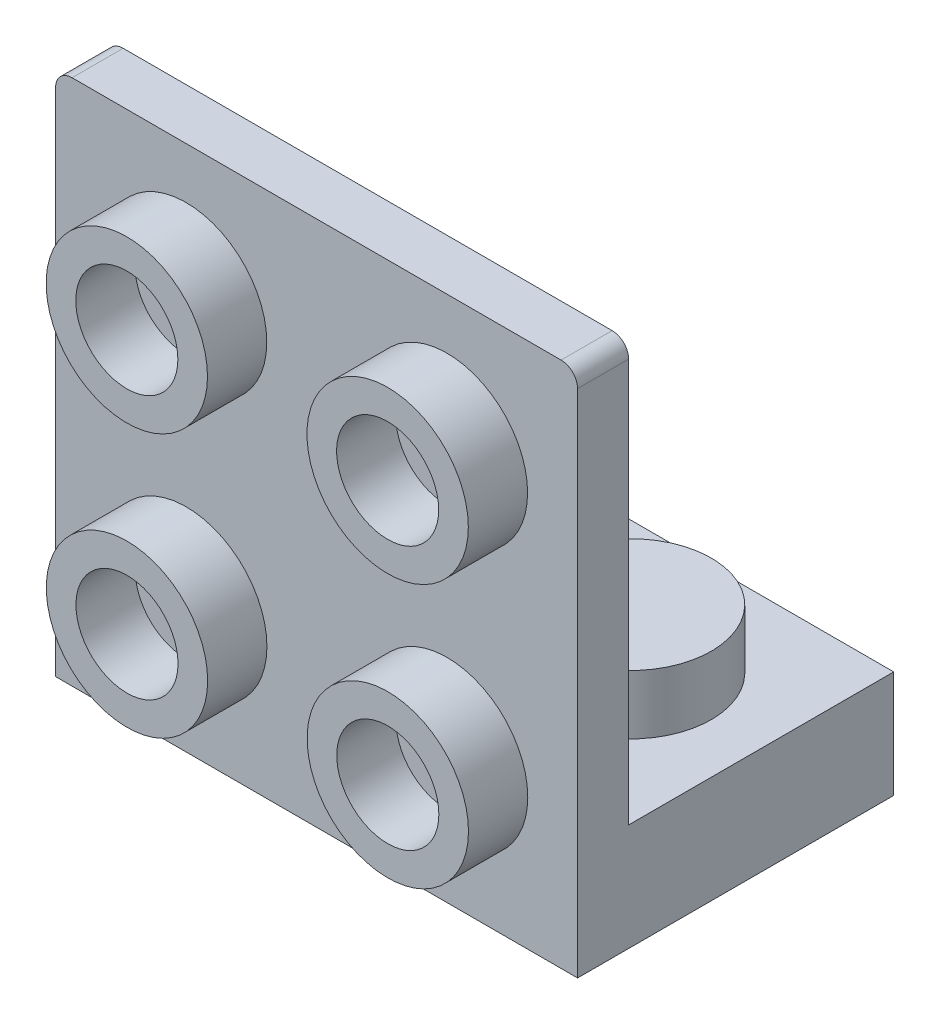
ISO-10303-21;
HEADER;
FILE_DESCRIPTION(('STEP AP214'),'2;1');
FILE_NAME('part.step','',(''),(''),'','','');
FILE_SCHEMA(('AUTOMOTIVE_DESIGN { 1 0 10303 214 1 1 1 1 }'));
ENDSEC;
DATA;
#1=APPLICATION_CONTEXT('core data for automotive mechanical design processes');
#2=APPLICATION_PROTOCOL_DEFINITION('international standard','automotive_design',2000,#1);
#3=PRODUCT_CONTEXT('',#1,'mechanical');
#4=PRODUCT('Part','Part','',(#3));
#5=PRODUCT_RELATED_PRODUCT_CATEGORY('part','',(#4));
#6=PRODUCT_DEFINITION_FORMATION('','',#4);
#7=PRODUCT_DEFINITION_CONTEXT('part definition',#1,'design');
#8=PRODUCT_DEFINITION('design','',#6,#7);
#9=PRODUCT_DEFINITION_SHAPE('','',#8);
#10=(LENGTH_UNIT() NAMED_UNIT(*) SI_UNIT(.MILLI.,.METRE.));
#11=(NAMED_UNIT(*) PLANE_ANGLE_UNIT() SI_UNIT($,.RADIAN.));
#12=(NAMED_UNIT(*) SI_UNIT($,.STERADIAN.) SOLID_ANGLE_UNIT());
#13=UNCERTAINTY_MEASURE_WITH_UNIT(LENGTH_MEASURE(1.E-05),#10,'distance_accuracy_value','');
#14=(GEOMETRIC_REPRESENTATION_CONTEXT(3) GLOBAL_UNCERTAINTY_ASSIGNED_CONTEXT((#13)) GLOBAL_UNIT_ASSIGNED_CONTEXT((#10,
#11,#12)) REPRESENTATION_CONTEXT('',''));
#15=CARTESIAN_POINT('',(0.,0.,0.));
#16=DIRECTION('',(0.,0.,1.));
#17=DIRECTION('',(1.,0.,0.));
#18=AXIS2_PLACEMENT_3D('',#15,#16,#17);
#19=CARTESIAN_POINT('',(-15.85,16.,-1.55));
#20=DIRECTION('',(0.,1.,0.));
#21=DIRECTION('',(0.,0.,1.));
#22=AXIS2_PLACEMENT_3D('',#19,#20,#21);
#23=PLANE('',#22);
#24=DIRECTION('',(1.,0.,0.));
#25=VECTOR('',#24,1.);
#26=CARTESIAN_POINT('',(-15.85,16.,0.));
#27=LINE('',#26,#25);
#28=CARTESIAN_POINT('',(-15.35,16.,0.));
#29=VERTEX_POINT('',#28);
#30=CARTESIAN_POINT('',(-0.5,16.,0.));
#31=VERTEX_POINT('',#30);
#32=EDGE_CURVE('E199',#29,#31,#27,.T.);
#33=ORIENTED_EDGE('',*,*,#32,.T.);
#34=DIRECTION('',(0.,0.,1.));
#35=VECTOR('',#34,1.);
#36=CARTESIAN_POINT('',(-0.5,16.,-1.55));
#37=LINE('',#36,#35);
#38=CARTESIAN_POINT('',(-0.5,16.,-1.55));
#39=VERTEX_POINT('',#38);
#40=EDGE_CURVE('E56',#31,#39,#37,.F.);
#41=ORIENTED_EDGE('',*,*,#40,.T.);
#42=DIRECTION('',(1.,0.,0.));
#43=VECTOR('',#42,1.);
#44=CARTESIAN_POINT('',(-15.85,16.,-1.55));
#45=LINE('',#44,#43);
#46=CARTESIAN_POINT('',(-15.35,16.,-1.55));
#47=VERTEX_POINT('',#46);
#48=EDGE_CURVE('E212',#47,#39,#45,.T.);
#49=ORIENTED_EDGE('',*,*,#48,.F.);
#50=DIRECTION('',(0.,0.,1.));
#51=VECTOR('',#50,1.);
#52=CARTESIAN_POINT('',(-15.35,16.,0.));
#53=LINE('',#52,#51);
#54=EDGE_CURVE('E246',#47,#29,#53,.T.);
#55=ORIENTED_EDGE('',*,*,#54,.T.);
#56=EDGE_LOOP('',(#33,#41,#49,#55));
#57=FACE_BOUND('',#56,.T.);
#58=ADVANCED_FACE('F35',(#57),#23,.T.);
#59=CARTESIAN_POINT('',(-15.85,3.25,-1.55));
#60=DIRECTION('',(0.,0.,-1.));
#61=DIRECTION('',(0.,1.,0.));
#62=AXIS2_PLACEMENT_3D('',#59,#60,#61);
#63=PLANE('',#62);
#64=ORIENTED_EDGE('',*,*,#48,.T.);
#65=CARTESIAN_POINT('',(-0.5,15.5,-1.55));
#66=DIRECTION('',(0.,0.,-1.));
#67=DIRECTION('',(0.,1.,0.));
#68=AXIS2_PLACEMENT_3D('',#65,#66,#67);
#69=CIRCLE('',#68,0.5);
#70=CARTESIAN_POINT('',(0.,15.5,-1.55));
#71=VERTEX_POINT('',#70);
#72=EDGE_CURVE('E43',#39,#71,#69,.T.);
#73=ORIENTED_EDGE('',*,*,#72,.T.);
#74=DIRECTION('',(0.,1.,0.));
#75=VECTOR('',#74,1.);
#76=CARTESIAN_POINT('',(0.,3.25,-1.55));
#77=LINE('',#76,#75);
#78=CARTESIAN_POINT('',(0.,3.25,-1.55));
#79=VERTEX_POINT('',#78);
#80=EDGE_CURVE('E188',#79,#71,#77,.T.);
#81=ORIENTED_EDGE('',*,*,#80,.F.);
#82=DIRECTION('',(1.,0.,0.));
#83=VECTOR('',#82,1.);
#84=CARTESIAN_POINT('',(-15.85,3.25,-1.55));
#85=LINE('',#84,#83);
#86=CARTESIAN_POINT('',(-15.85,3.25,-1.55));
#87=VERTEX_POINT('',#86);
#88=EDGE_CURVE('E215',#87,#79,#85,.T.);
#89=ORIENTED_EDGE('',*,*,#88,.F.);
#90=DIRECTION('',(0.,1.,0.));
#91=VECTOR('',#90,1.);
#92=CARTESIAN_POINT('',(-15.85,3.25,-1.55));
#93=LINE('',#92,#91);
#94=CARTESIAN_POINT('',(-15.85,15.5,-1.55));
#95=VERTEX_POINT('',#94);
#96=EDGE_CURVE('E197',#87,#95,#93,.T.);
#97=ORIENTED_EDGE('',*,*,#96,.T.);
#98=CARTESIAN_POINT('',(-15.35,15.5,-1.55));
#99=DIRECTION('',(0.,0.,-1.));
#100=DIRECTION('',(0.,1.,0.));
#101=AXIS2_PLACEMENT_3D('',#98,#99,#100);
#102=CIRCLE('',#101,0.5);
#103=EDGE_CURVE('E250',#95,#47,#102,.T.);
#104=ORIENTED_EDGE('',*,*,#103,.T.);
#105=EDGE_LOOP('',(#64,#73,#81,#89,#97,#104));
#106=FACE_BOUND('',#105,.T.);
#107=ADVANCED_FACE('F254',(#106),#63,.T.);
#108=CARTESIAN_POINT('',(-15.85,3.25,-9.6));
#109=DIRECTION('',(0.,1.,0.));
#110=DIRECTION('',(0.,0.,1.));
#111=AXIS2_PLACEMENT_3D('',#108,#109,#110);
#112=PLANE('',#111);
#113=CARTESIAN_POINT('',(-3.9625,3.25,-5.575));
#114=DIRECTION('',(0.,1.,0.));
#115=DIRECTION('',(0.,0.,1.));
#116=AXIS2_PLACEMENT_3D('',#113,#114,#115);
#117=CIRCLE('',#116,2.45);
#118=CARTESIAN_POINT('',(-3.9625,3.25,-3.125));
#119=VERTEX_POINT('',#118);
#120=EDGE_CURVE('E169',#119,#119,#117,.T.);
#121=ORIENTED_EDGE('',*,*,#120,.F.);
#122=EDGE_LOOP('',(#121));
#123=FACE_BOUND('',#122,.T.);
#124=CARTESIAN_POINT('',(-11.8875,3.25,-5.575));
#125=DIRECTION('',(0.,1.,0.));
#126=DIRECTION('',(0.,0.,1.));
#127=AXIS2_PLACEMENT_3D('',#124,#125,#126);
#128=CIRCLE('',#127,2.45);
#129=CARTESIAN_POINT('',(-11.8875,3.25,-3.125));
#130=VERTEX_POINT('',#129);
#131=EDGE_CURVE('E176',#130,#130,#128,.T.);
#132=ORIENTED_EDGE('',*,*,#131,.F.);
#133=EDGE_LOOP('',(#132));
#134=FACE_BOUND('',#133,.T.);
#135=DIRECTION('',(0.,0.,1.));
#136=VECTOR('',#135,1.);
#137=CARTESIAN_POINT('',(0.,3.25,-9.6));
#138=LINE('',#137,#136);
#139=CARTESIAN_POINT('',(0.,3.25,-9.6));
#140=VERTEX_POINT('',#139);
#141=EDGE_CURVE('E207',#140,#79,#138,.T.);
#142=ORIENTED_EDGE('',*,*,#141,.F.);
#143=DIRECTION('',(1.,0.,0.));
#144=VECTOR('',#143,1.);
#145=CARTESIAN_POINT('',(-15.85,3.25,-9.6));
#146=LINE('',#145,#144);
#147=CARTESIAN_POINT('',(-15.85,3.25,-9.6));
#148=VERTEX_POINT('',#147);
#149=EDGE_CURVE('E217',#148,#140,#146,.T.);
#150=ORIENTED_EDGE('',*,*,#149,.F.);
#151=DIRECTION('',(0.,0.,1.));
#152=VECTOR('',#151,1.);
#153=CARTESIAN_POINT('',(-15.85,3.25,-9.6));
#154=LINE('',#153,#152);
#155=EDGE_CURVE('E194',#148,#87,#154,.T.);
#156=ORIENTED_EDGE('',*,*,#155,.T.);
#157=ORIENTED_EDGE('',*,*,#88,.T.);
#158=EDGE_LOOP('',(#142,#150,#156,#157));
#159=FACE_BOUND('',#158,.T.);
#160=ADVANCED_FACE('F280',(#123,#134,#159),#112,.T.);
#161=CARTESIAN_POINT('',(-15.85,0.,-9.6));
#162=DIRECTION('',(0.,0.,-1.));
#163=DIRECTION('',(-1.,0.,0.));
#164=AXIS2_PLACEMENT_3D('',#161,#162,#163);
#165=PLANE('',#164);
#166=DIRECTION('',(0.,1.,0.));
#167=VECTOR('',#166,1.);
#168=CARTESIAN_POINT('',(0.,0.,-9.6));
#169=LINE('',#168,#167);
#170=CARTESIAN_POINT('',(0.,0.,-9.6));
#171=VERTEX_POINT('',#170);
#172=EDGE_CURVE('E204',#171,#140,#169,.T.);
#173=ORIENTED_EDGE('',*,*,#172,.F.);
#174=DIRECTION('',(1.,0.,0.));
#175=VECTOR('',#174,1.);
#176=CARTESIAN_POINT('',(-15.85,0.,-9.6));
#177=LINE('',#176,#175);
#178=CARTESIAN_POINT('',(-15.85,0.,-9.6));
#179=VERTEX_POINT('',#178);
#180=EDGE_CURVE('E219',#179,#171,#177,.T.);
#181=ORIENTED_EDGE('',*,*,#180,.F.);
#182=DIRECTION('',(0.,1.,0.));
#183=VECTOR('',#182,1.);
#184=CARTESIAN_POINT('',(-15.85,0.,-9.6));
#185=LINE('',#184,#183);
#186=EDGE_CURVE('E191',#179,#148,#185,.T.);
#187=ORIENTED_EDGE('',*,*,#186,.T.);
#188=ORIENTED_EDGE('',*,*,#149,.T.);
#189=EDGE_LOOP('',(#173,#181,#187,#188));
#190=FACE_BOUND('',#189,.T.);
#191=ADVANCED_FACE('F278',(#190),#165,.T.);
#192=CARTESIAN_POINT('',(-15.85,0.,0.));
#193=DIRECTION('',(0.,-1.,0.));
#194=DIRECTION('',(0.,0.,-1.));
#195=AXIS2_PLACEMENT_3D('',#192,#193,#194);
#196=PLANE('',#195);
#197=DIRECTION('',(0.,0.,1.));
#198=VECTOR('',#197,1.);
#199=CARTESIAN_POINT('',(-1.5,0.,-1.6));
#200=LINE('',#199,#198);
#201=CARTESIAN_POINT('',(-1.5,0.,-8.1));
#202=VERTEX_POINT('',#201);
#203=CARTESIAN_POINT('',(-1.5,0.,-1.6));
#204=VERTEX_POINT('',#203);
#205=EDGE_CURVE('E133',#202,#204,#200,.T.);
#206=ORIENTED_EDGE('',*,*,#205,.F.);
#207=DIRECTION('',(1.,0.,0.));
#208=VECTOR('',#207,1.);
#209=CARTESIAN_POINT('',(-14.35,0.,-8.1));
#210=LINE('',#209,#208);
#211=CARTESIAN_POINT('',(-14.35,0.,-8.1));
#212=VERTEX_POINT('',#211);
#213=EDGE_CURVE('E150',#212,#202,#210,.T.);
#214=ORIENTED_EDGE('',*,*,#213,.F.);
#215=DIRECTION('',(0.,0.,-1.));
#216=VECTOR('',#215,1.);
#217=CARTESIAN_POINT('',(-14.35,0.,-1.6));
#218=LINE('',#217,#216);
#219=CARTESIAN_POINT('',(-14.35,0.,-1.6));
#220=VERTEX_POINT('',#219);
#221=EDGE_CURVE('E153',#220,#212,#218,.T.);
#222=ORIENTED_EDGE('',*,*,#221,.F.);
#223=DIRECTION('',(-1.,0.,0.));
#224=VECTOR('',#223,1.);
#225=CARTESIAN_POINT('',(-14.35,0.,-1.6));
#226=LINE('',#225,#224);
#227=EDGE_CURVE('E162',#204,#220,#226,.T.);
#228=ORIENTED_EDGE('',*,*,#227,.F.);
#229=EDGE_LOOP('',(#206,#214,#222,#228));
#230=FACE_BOUND('',#229,.T.);
#231=DIRECTION('',(0.,0.,-1.));
#232=VECTOR('',#231,1.);
#233=CARTESIAN_POINT('',(0.,0.,0.));
#234=LINE('',#233,#232);
#235=CARTESIAN_POINT('',(0.,0.,0.));
#236=VERTEX_POINT('',#235);
#237=EDGE_CURVE('E201',#236,#171,#234,.T.);
#238=ORIENTED_EDGE('',*,*,#237,.F.);
#239=DIRECTION('',(1.,0.,0.));
#240=VECTOR('',#239,1.);
#241=CARTESIAN_POINT('',(-15.85,0.,0.));
#242=LINE('',#241,#240);
#243=CARTESIAN_POINT('',(-15.85,0.,0.));
#244=VERTEX_POINT('',#243);
#245=EDGE_CURVE('E221',#244,#236,#242,.T.);
#246=ORIENTED_EDGE('',*,*,#245,.F.);
#247=DIRECTION('',(0.,0.,-1.));
#248=VECTOR('',#247,1.);
#249=CARTESIAN_POINT('',(-15.85,0.,0.));
#250=LINE('',#249,#248);
#251=EDGE_CURVE('E187',#244,#179,#250,.T.);
#252=ORIENTED_EDGE('',*,*,#251,.T.);
#253=ORIENTED_EDGE('',*,*,#180,.T.);
#254=EDGE_LOOP('',(#238,#246,#252,#253));
#255=FACE_BOUND('',#254,.T.);
#256=ADVANCED_FACE('F275',(#230,#255),#196,.T.);
#257=CARTESIAN_POINT('',(-15.85,16.,0.));
#258=DIRECTION('',(0.,0.,1.));
#259=DIRECTION('',(0.,-1.,0.));
#260=AXIS2_PLACEMENT_3D('',#257,#258,#259);
#261=PLANE('',#260);
#262=CARTESIAN_POINT('',(-11.8825,4.00000156250015,0.));
#263=DIRECTION('',(0.,0.,1.));
#264=DIRECTION('',(1.,0.,0.));
#265=AXIS2_PLACEMENT_3D('',#262,#263,#264);
#266=CIRCLE('',#265,2.45);
#267=CARTESIAN_POINT('',(-9.4325,4.00000156250015,0.));
#268=VERTEX_POINT('',#267);
#269=EDGE_CURVE('E696',#268,#268,#266,.T.);
#270=ORIENTED_EDGE('',*,*,#269,.F.);
#271=EDGE_LOOP('',(#270));
#272=FACE_BOUND('',#271,.T.);
#273=CARTESIAN_POINT('',(-3.9625,4.00000156250015,0.));
#274=DIRECTION('',(0.,0.,1.));
#275=DIRECTION('',(1.,0.,0.));
#276=AXIS2_PLACEMENT_3D('',#273,#274,#275);
#277=CIRCLE('',#276,2.45);
#278=CARTESIAN_POINT('',(-1.5125,4.00000156250015,0.));
#279=VERTEX_POINT('',#278);
#280=EDGE_CURVE('E706',#279,#279,#277,.T.);
#281=ORIENTED_EDGE('',*,*,#280,.F.);
#282=EDGE_LOOP('',(#281));
#283=FACE_BOUND('',#282,.T.);
#284=CARTESIAN_POINT('',(-3.9675,12.,0.));
#285=DIRECTION('',(0.,0.,1.));
#286=DIRECTION('',(1.,0.,0.));
#287=AXIS2_PLACEMENT_3D('',#284,#285,#286);
#288=CIRCLE('',#287,2.45);
#289=CARTESIAN_POINT('',(-1.5175,12.,0.));
#290=VERTEX_POINT('',#289);
#291=EDGE_CURVE('E714',#290,#290,#288,.T.);
#292=ORIENTED_EDGE('',*,*,#291,.F.);
#293=EDGE_LOOP('',(#292));
#294=FACE_BOUND('',#293,.T.);
#295=CARTESIAN_POINT('',(-11.8875,12.,0.));
#296=DIRECTION('',(0.,0.,1.));
#297=DIRECTION('',(1.,0.,0.));
#298=AXIS2_PLACEMENT_3D('',#295,#296,#297);
#299=CIRCLE('',#298,2.45);
#300=CARTESIAN_POINT('',(-9.4375,12.,0.));
#301=VERTEX_POINT('',#300);
#302=EDGE_CURVE('E723',#301,#301,#299,.T.);
#303=ORIENTED_EDGE('',*,*,#302,.F.);
#304=EDGE_LOOP('',(#303));
#305=FACE_BOUND('',#304,.T.);
#306=DIRECTION('',(0.,-1.,0.));
#307=VECTOR('',#306,1.);
#308=CARTESIAN_POINT('',(0.,16.,0.));
#309=LINE('',#308,#307);
#310=CARTESIAN_POINT('',(0.,15.5,0.));
#311=VERTEX_POINT('',#310);
#312=EDGE_CURVE('E182',#311,#236,#309,.T.);
#313=ORIENTED_EDGE('',*,*,#312,.F.);
#314=CARTESIAN_POINT('',(-0.5,15.5,0.));
#315=DIRECTION('',(0.,0.,1.));
#316=DIRECTION('',(0.,-1.,0.));
#317=AXIS2_PLACEMENT_3D('',#314,#315,#316);
#318=CIRCLE('',#317,0.5);
#319=EDGE_CURVE('E244',#311,#31,#318,.T.);
#320=ORIENTED_EDGE('',*,*,#319,.T.);
#321=ORIENTED_EDGE('',*,*,#32,.F.);
#322=CARTESIAN_POINT('',(-15.35,15.5,0.));
#323=DIRECTION('',(0.,0.,1.));
#324=DIRECTION('',(0.,-1.,0.));
#325=AXIS2_PLACEMENT_3D('',#322,#323,#324);
#326=CIRCLE('',#325,0.5);
#327=CARTESIAN_POINT('',(-15.85,15.5,0.));
#328=VERTEX_POINT('',#327);
#329=EDGE_CURVE('E242',#29,#328,#326,.T.);
#330=ORIENTED_EDGE('',*,*,#329,.T.);
#331=DIRECTION('',(0.,-1.,0.));
#332=VECTOR('',#331,1.);
#333=CARTESIAN_POINT('',(-15.85,16.,0.));
#334=LINE('',#333,#332);
#335=EDGE_CURVE('E185',#328,#244,#334,.T.);
#336=ORIENTED_EDGE('',*,*,#335,.T.);
#337=ORIENTED_EDGE('',*,*,#245,.T.);
#338=EDGE_LOOP('',(#313,#320,#321,#330,#336,#337));
#339=FACE_BOUND('',#338,.T.);
#340=ADVANCED_FACE('F264',(#272,#283,#294,#305,#339),#261,.T.);
#341=CARTESIAN_POINT('',(-15.85,0.,0.));
#342=DIRECTION('',(1.,0.,0.));
#343=DIRECTION('',(0.,0.,-1.));
#344=AXIS2_PLACEMENT_3D('',#341,#342,#343);
#345=PLANE('',#344);
#346=ORIENTED_EDGE('',*,*,#335,.F.);
#347=DIRECTION('',(0.,0.,1.));
#348=VECTOR('',#347,1.);
#349=CARTESIAN_POINT('',(-15.85,15.5,-1.55));
#350=LINE('',#349,#348);
#351=EDGE_CURVE('E12',#328,#95,#350,.F.);
#352=ORIENTED_EDGE('',*,*,#351,.T.);
#353=ORIENTED_EDGE('',*,*,#96,.F.);
#354=ORIENTED_EDGE('',*,*,#155,.F.);
#355=ORIENTED_EDGE('',*,*,#186,.F.);
#356=ORIENTED_EDGE('',*,*,#251,.F.);
#357=EDGE_LOOP('',(#346,#352,#353,#354,#355,#356));
#358=FACE_BOUND('',#357,.T.);
#359=ADVANCED_FACE('F270',(#358),#345,.F.);
#360=CARTESIAN_POINT('',(0.,0.,0.));
#361=DIRECTION('',(1.,0.,0.));
#362=DIRECTION('',(0.,0.,-1.));
#363=AXIS2_PLACEMENT_3D('',#360,#361,#362);
#364=PLANE('',#363);
#365=ORIENTED_EDGE('',*,*,#80,.T.);
#366=DIRECTION('',(0.,0.,1.));
#367=VECTOR('',#366,1.);
#368=CARTESIAN_POINT('',(0.,15.5,0.));
#369=LINE('',#368,#367);
#370=EDGE_CURVE('E239',#71,#311,#369,.T.);
#371=ORIENTED_EDGE('',*,*,#370,.T.);
#372=ORIENTED_EDGE('',*,*,#312,.T.);
#373=ORIENTED_EDGE('',*,*,#237,.T.);
#374=ORIENTED_EDGE('',*,*,#172,.T.);
#375=ORIENTED_EDGE('',*,*,#141,.T.);
#376=EDGE_LOOP('',(#365,#371,#372,#373,#374,#375));
#377=FACE_BOUND('',#376,.T.);
#378=ADVANCED_FACE('F258',(#377),#364,.T.);
#379=CARTESIAN_POINT('',(-11.8875,5.05,-5.575));
#380=DIRECTION('',(0.,-1.,0.));
#381=DIRECTION('',(0.,0.,-1.));
#382=AXIS2_PLACEMENT_3D('',#379,#380,#381);
#383=CYLINDRICAL_SURFACE('',#382,2.45);
#384=CARTESIAN_POINT('',(-11.8875,5.05,-5.575));
#385=DIRECTION('',(0.,1.,0.));
#386=DIRECTION('',(0.,0.,1.));
#387=AXIS2_PLACEMENT_3D('',#384,#385,#386);
#388=CIRCLE('',#387,2.45);
#389=CARTESIAN_POINT('',(-11.8875,5.05,-3.125));
#390=VERTEX_POINT('',#389);
#391=EDGE_CURVE('E179',#390,#390,#388,.T.);
#392=ORIENTED_EDGE('',*,*,#391,.F.);
#393=EDGE_LOOP('',(#392));
#394=FACE_BOUND('',#393,.T.);
#395=ORIENTED_EDGE('',*,*,#131,.T.);
#396=EDGE_LOOP('',(#395));
#397=FACE_BOUND('',#396,.T.);
#398=ADVANCED_FACE('F430',(#394,#397),#383,.T.);
#399=CARTESIAN_POINT('',(-11.8875,5.05,-5.575));
#400=DIRECTION('',(0.,1.,0.));
#401=DIRECTION('',(0.,0.,1.));
#402=AXIS2_PLACEMENT_3D('',#399,#400,#401);
#403=PLANE('',#402);
#404=ORIENTED_EDGE('',*,*,#391,.T.);
#405=EDGE_LOOP('',(#404));
#406=FACE_BOUND('',#405,.T.);
#407=ADVANCED_FACE('F426',(#406),#403,.T.);
#408=CARTESIAN_POINT('',(-3.9625,5.05,-5.575));
#409=DIRECTION('',(0.,-1.,0.));
#410=DIRECTION('',(0.,0.,-1.));
#411=AXIS2_PLACEMENT_3D('',#408,#409,#410);
#412=CYLINDRICAL_SURFACE('',#411,2.45);
#413=CARTESIAN_POINT('',(-3.9625,5.05,-5.575));
#414=DIRECTION('',(0.,1.,0.));
#415=DIRECTION('',(0.,0.,1.));
#416=AXIS2_PLACEMENT_3D('',#413,#414,#415);
#417=CIRCLE('',#416,2.45);
#418=CARTESIAN_POINT('',(-3.9625,5.05,-3.125));
#419=VERTEX_POINT('',#418);
#420=EDGE_CURVE('E173',#419,#419,#417,.T.);
#421=ORIENTED_EDGE('',*,*,#420,.F.);
#422=EDGE_LOOP('',(#421));
#423=FACE_BOUND('',#422,.T.);
#424=ORIENTED_EDGE('',*,*,#120,.T.);
#425=EDGE_LOOP('',(#424));
#426=FACE_BOUND('',#425,.T.);
#427=ADVANCED_FACE('F422',(#423,#426),#412,.T.);
#428=CARTESIAN_POINT('',(-3.9625,5.05,-5.575));
#429=DIRECTION('',(0.,1.,0.));
#430=DIRECTION('',(0.,0.,1.));
#431=AXIS2_PLACEMENT_3D('',#428,#429,#430);
#432=PLANE('',#431);
#433=ORIENTED_EDGE('',*,*,#420,.T.);
#434=EDGE_LOOP('',(#433));
#435=FACE_BOUND('',#434,.T.);
#436=ADVANCED_FACE('F419',(#435),#432,.T.);
#437=CARTESIAN_POINT('',(-1.5,2.05,-1.6));
#438=DIRECTION('',(1.,0.,0.));
#439=DIRECTION('',(0.,0.,-1.));
#440=AXIS2_PLACEMENT_3D('',#437,#438,#439);
#441=PLANE('',#440);
#442=ORIENTED_EDGE('',*,*,#205,.T.);
#443=DIRECTION('',(0.,-1.,0.));
#444=VECTOR('',#443,1.);
#445=CARTESIAN_POINT('',(-1.5,2.05,-1.6));
#446=LINE('',#445,#444);
#447=CARTESIAN_POINT('',(-1.5,2.05,-1.6));
#448=VERTEX_POINT('',#447);
#449=EDGE_CURVE('E126',#448,#204,#446,.T.);
#450=ORIENTED_EDGE('',*,*,#449,.F.);
#451=DIRECTION('',(0.,0.,1.));
#452=VECTOR('',#451,1.);
#453=CARTESIAN_POINT('',(-1.5,2.05,-1.6));
#454=LINE('',#453,#452);
#455=CARTESIAN_POINT('',(-1.5,2.05,-8.1));
#456=VERTEX_POINT('',#455);
#457=EDGE_CURVE('E130',#456,#448,#454,.T.);
#458=ORIENTED_EDGE('',*,*,#457,.F.);
#459=DIRECTION('',(0.,-1.,0.));
#460=VECTOR('',#459,1.);
#461=CARTESIAN_POINT('',(-1.5,2.05,-8.1));
#462=LINE('',#461,#460);
#463=EDGE_CURVE('E167',#456,#202,#462,.T.);
#464=ORIENTED_EDGE('',*,*,#463,.T.);
#465=EDGE_LOOP('',(#442,#450,#458,#464));
#466=FACE_BOUND('',#465,.T.);
#467=ADVANCED_FACE('F128',(#466),#441,.F.);
#468=CARTESIAN_POINT('',(-14.35,2.05,-8.1));
#469=DIRECTION('',(0.,0.,-1.));
#470=DIRECTION('',(-1.,0.,0.));
#471=AXIS2_PLACEMENT_3D('',#468,#469,#470);
#472=PLANE('',#471);
#473=ORIENTED_EDGE('',*,*,#213,.T.);
#474=ORIENTED_EDGE('',*,*,#463,.F.);
#475=DIRECTION('',(1.,0.,0.));
#476=VECTOR('',#475,1.);
#477=CARTESIAN_POINT('',(-14.35,2.05,-8.1));
#478=LINE('',#477,#476);
#479=CARTESIAN_POINT('',(-14.35,2.05,-8.1));
#480=VERTEX_POINT('',#479);
#481=EDGE_CURVE('E138',#480,#456,#478,.T.);
#482=ORIENTED_EDGE('',*,*,#481,.F.);
#483=DIRECTION('',(0.,-1.,0.));
#484=VECTOR('',#483,1.);
#485=CARTESIAN_POINT('',(-14.35,2.05,-8.1));
#486=LINE('',#485,#484);
#487=EDGE_CURVE('E170',#480,#212,#486,.T.);
#488=ORIENTED_EDGE('',*,*,#487,.T.);
#489=EDGE_LOOP('',(#473,#474,#482,#488));
#490=FACE_BOUND('',#489,.T.);
#491=ADVANCED_FACE('F407',(#490),#472,.F.);
#492=CARTESIAN_POINT('',(-14.35,2.05,-1.6));
#493=DIRECTION('',(-1.,0.,0.));
#494=DIRECTION('',(0.,0.,1.));
#495=AXIS2_PLACEMENT_3D('',#492,#493,#494);
#496=PLANE('',#495);
#497=ORIENTED_EDGE('',*,*,#221,.T.);
#498=ORIENTED_EDGE('',*,*,#487,.F.);
#499=DIRECTION('',(0.,0.,-1.));
#500=VECTOR('',#499,1.);
#501=CARTESIAN_POINT('',(-14.35,2.05,-1.6));
#502=LINE('',#501,#500);
#503=CARTESIAN_POINT('',(-14.35,2.05,-1.6));
#504=VERTEX_POINT('',#503);
#505=EDGE_CURVE('E146',#504,#480,#502,.T.);
#506=ORIENTED_EDGE('',*,*,#505,.F.);
#507=DIRECTION('',(0.,-1.,0.));
#508=VECTOR('',#507,1.);
#509=CARTESIAN_POINT('',(-14.35,2.05,-1.6));
#510=LINE('',#509,#508);
#511=EDGE_CURVE('E137',#504,#220,#510,.T.);
#512=ORIENTED_EDGE('',*,*,#511,.T.);
#513=EDGE_LOOP('',(#497,#498,#506,#512));
#514=FACE_BOUND('',#513,.T.);
#515=ADVANCED_FACE('F410',(#514),#496,.F.);
#516=CARTESIAN_POINT('',(-14.35,2.05,-1.6));
#517=DIRECTION('',(0.,0.,1.));
#518=DIRECTION('',(1.,0.,0.));
#519=AXIS2_PLACEMENT_3D('',#516,#517,#518);
#520=PLANE('',#519);
#521=ORIENTED_EDGE('',*,*,#227,.T.);
#522=ORIENTED_EDGE('',*,*,#511,.F.);
#523=DIRECTION('',(-1.,0.,0.));
#524=VECTOR('',#523,1.);
#525=CARTESIAN_POINT('',(-14.35,2.05,-1.6));
#526=LINE('',#525,#524);
#527=EDGE_CURVE('E141',#448,#504,#526,.T.);
#528=ORIENTED_EDGE('',*,*,#527,.F.);
#529=ORIENTED_EDGE('',*,*,#449,.T.);
#530=EDGE_LOOP('',(#521,#522,#528,#529));
#531=FACE_BOUND('',#530,.T.);
#532=ADVANCED_FACE('F142',(#531),#520,.F.);
#533=CARTESIAN_POINT('',(0.,2.05,0.));
#534=DIRECTION('',(0.,-1.,0.));
#535=DIRECTION('',(0.,0.,-1.));
#536=AXIS2_PLACEMENT_3D('',#533,#534,#535);
#537=PLANE('',#536);
#538=CARTESIAN_POINT('',(-7.925,2.05,-5.57));
#539=DIRECTION('',(0.,-1.,0.));
#540=DIRECTION('',(0.,0.,-1.));
#541=AXIS2_PLACEMENT_3D('',#538,#539,#540);
#542=CIRCLE('',#541,1.5);
#543=CARTESIAN_POINT('',(-7.925,2.05,-7.07));
#544=VERTEX_POINT('',#543);
#545=EDGE_CURVE('E734',#544,#544,#542,.T.);
#546=ORIENTED_EDGE('',*,*,#545,.F.);
#547=EDGE_LOOP('',(#546));
#548=FACE_BOUND('',#547,.T.);
#549=CARTESIAN_POINT('',(-11.8875,2.05,-5.575));
#550=DIRECTION('',(0.,-1.,0.));
#551=DIRECTION('',(0.,0.,-1.));
#552=AXIS2_PLACEMENT_3D('',#549,#550,#551);
#553=CIRCLE('',#552,0.949999999999999);
#554=CARTESIAN_POINT('',(-11.8875,2.05,-6.525));
#555=VERTEX_POINT('',#554);
#556=EDGE_CURVE('E739',#555,#555,#553,.T.);
#557=ORIENTED_EDGE('',*,*,#556,.F.);
#558=EDGE_LOOP('',(#557));
#559=FACE_BOUND('',#558,.T.);
#560=CARTESIAN_POINT('',(-3.9625,2.05,-5.575));
#561=DIRECTION('',(0.,-1.,0.));
#562=DIRECTION('',(0.,0.,-1.));
#563=AXIS2_PLACEMENT_3D('',#560,#561,#562);
#564=CIRCLE('',#563,0.950000000000001);
#565=CARTESIAN_POINT('',(-3.9625,2.05,-6.525));
#566=VERTEX_POINT('',#565);
#567=EDGE_CURVE('E733',#566,#566,#564,.T.);
#568=ORIENTED_EDGE('',*,*,#567,.F.);
#569=EDGE_LOOP('',(#568));
#570=FACE_BOUND('',#569,.T.);
#571=ORIENTED_EDGE('',*,*,#457,.T.);
#572=ORIENTED_EDGE('',*,*,#527,.T.);
#573=ORIENTED_EDGE('',*,*,#505,.T.);
#574=ORIENTED_EDGE('',*,*,#481,.T.);
#575=EDGE_LOOP('',(#571,#572,#573,#574));
#576=FACE_BOUND('',#575,.T.);
#577=ADVANCED_FACE('F148',(#548,#559,#570,#576),#537,.T.);
#578=CARTESIAN_POINT('',(-11.8875,3.55,-5.575));
#579=DIRECTION('',(0.,1.,0.));
#580=DIRECTION('',(0.,0.,1.));
#581=AXIS2_PLACEMENT_3D('',#578,#579,#580);
#582=PLANE('',#581);
#583=CARTESIAN_POINT('',(-3.9625,3.55,-5.575));
#584=DIRECTION('',(0.,1.,0.));
#585=DIRECTION('',(0.,0.,1.));
#586=AXIS2_PLACEMENT_3D('',#583,#584,#585);
#587=CIRCLE('',#586,0.950000000000001);
#588=CARTESIAN_POINT('',(-3.9625,3.55,-4.625));
#589=VERTEX_POINT('',#588);
#590=EDGE_CURVE('E156',#589,#589,#587,.F.);
#591=ORIENTED_EDGE('',*,*,#590,.T.);
#592=EDGE_LOOP('',(#591));
#593=FACE_BOUND('',#592,.T.);
#594=ADVANCED_FACE('F399',(#593),#582,.F.);
#595=CARTESIAN_POINT('',(-3.9625,7.73700576850888,-5.575));
#596=DIRECTION('',(0.,-1.,0.));
#597=DIRECTION('',(0.,0.,-1.));
#598=AXIS2_PLACEMENT_3D('',#595,#596,#597);
#599=CYLINDRICAL_SURFACE('',#598,0.950000000000001);
#600=ORIENTED_EDGE('',*,*,#567,.T.);
#601=EDGE_LOOP('',(#600));
#602=FACE_BOUND('',#601,.T.);
#603=ORIENTED_EDGE('',*,*,#590,.F.);
#604=EDGE_LOOP('',(#603));
#605=FACE_BOUND('',#604,.T.);
#606=ADVANCED_FACE('F395',(#602,#605),#599,.F.);
#607=CARTESIAN_POINT('',(-11.8875,3.55,-5.575));
#608=DIRECTION('',(0.,1.,0.));
#609=DIRECTION('',(0.,0.,1.));
#610=AXIS2_PLACEMENT_3D('',#607,#608,#609);
#611=PLANE('',#610);
#612=CARTESIAN_POINT('',(-11.8875,3.55,-5.575));
#613=DIRECTION('',(0.,1.,0.));
#614=DIRECTION('',(0.,0.,1.));
#615=AXIS2_PLACEMENT_3D('',#612,#613,#614);
#616=CIRCLE('',#615,0.949999999999999);
#617=CARTESIAN_POINT('',(-11.8875,3.55,-4.625));
#618=VERTEX_POINT('',#617);
#619=EDGE_CURVE('E163',#618,#618,#616,.F.);
#620=ORIENTED_EDGE('',*,*,#619,.T.);
#621=EDGE_LOOP('',(#620));
#622=FACE_BOUND('',#621,.T.);
#623=ADVANCED_FACE('F391',(#622),#611,.F.);
#624=CARTESIAN_POINT('',(-11.8875,7.73700576850888,-5.575));
#625=DIRECTION('',(0.,-1.,0.));
#626=DIRECTION('',(0.,0.,-1.));
#627=AXIS2_PLACEMENT_3D('',#624,#625,#626);
#628=CYLINDRICAL_SURFACE('',#627,0.949999999999999);
#629=ORIENTED_EDGE('',*,*,#556,.T.);
#630=EDGE_LOOP('',(#629));
#631=FACE_BOUND('',#630,.T.);
#632=ORIENTED_EDGE('',*,*,#619,.F.);
#633=EDGE_LOOP('',(#632));
#634=FACE_BOUND('',#633,.T.);
#635=ADVANCED_FACE('F387',(#631,#634),#628,.F.);
#636=CARTESIAN_POINT('',(-7.925,-4.24264068711928,-5.57));
#637=DIRECTION('',(0.,1.,0.));
#638=DIRECTION('',(0.,0.,1.));
#639=AXIS2_PLACEMENT_3D('',#636,#637,#638);
#640=CYLINDRICAL_SURFACE('',#639,1.5);
#641=ORIENTED_EDGE('',*,*,#545,.T.);
#642=EDGE_LOOP('',(#641));
#643=FACE_BOUND('',#642,.T.);
#644=CARTESIAN_POINT('',(-7.925,0.2,-5.57));
#645=DIRECTION('',(0.,-1.,0.));
#646=DIRECTION('',(0.,0.,-1.));
#647=AXIS2_PLACEMENT_3D('',#644,#645,#646);
#648=CIRCLE('',#647,1.5);
#649=CARTESIAN_POINT('',(-7.925,0.2,-7.07));
#650=VERTEX_POINT('',#649);
#651=EDGE_CURVE('E730',#650,#650,#648,.T.);
#652=ORIENTED_EDGE('',*,*,#651,.F.);
#653=EDGE_LOOP('',(#652));
#654=FACE_BOUND('',#653,.T.);
#655=ADVANCED_FACE('F383',(#643,#654),#640,.T.);
#656=CARTESIAN_POINT('',(-7.925,-4.24264068711928,-5.57));
#657=DIRECTION('',(0.,1.,0.));
#658=DIRECTION('',(0.,0.,1.));
#659=AXIS2_PLACEMENT_3D('',#656,#657,#658);
#660=CYLINDRICAL_SURFACE('',#659,0.7);
#661=CARTESIAN_POINT('',(-7.925,2.05,-5.57));
#662=DIRECTION('',(0.,-1.,0.));
#663=DIRECTION('',(0.,0.,-1.));
#664=AXIS2_PLACEMENT_3D('',#661,#662,#663);
#665=CIRCLE('',#664,0.7);
#666=CARTESIAN_POINT('',(-7.925,2.05,-6.27));
#667=VERTEX_POINT('',#666);
#668=EDGE_CURVE('E214',#667,#667,#665,.F.);
#669=ORIENTED_EDGE('',*,*,#668,.T.);
#670=EDGE_LOOP('',(#669));
#671=FACE_BOUND('',#670,.T.);
#672=CARTESIAN_POINT('',(-7.925,0.2,-5.57));
#673=DIRECTION('',(0.,-1.,0.));
#674=DIRECTION('',(0.,0.,-1.));
#675=AXIS2_PLACEMENT_3D('',#672,#673,#674);
#676=CIRCLE('',#675,0.7);
#677=CARTESIAN_POINT('',(-7.925,0.2,-6.27));
#678=VERTEX_POINT('',#677);
#679=EDGE_CURVE('E727',#678,#678,#676,.T.);
#680=ORIENTED_EDGE('',*,*,#679,.T.);
#681=EDGE_LOOP('',(#680));
#682=FACE_BOUND('',#681,.T.);
#683=ADVANCED_FACE('F379',(#671,#682),#660,.F.);
#684=CARTESIAN_POINT('',(-15.85,0.2,0.));
#685=DIRECTION('',(0.,-1.,0.));
#686=DIRECTION('',(0.,0.,-1.));
#687=AXIS2_PLACEMENT_3D('',#684,#685,#686);
#688=PLANE('',#687);
#689=ORIENTED_EDGE('',*,*,#679,.F.);
#690=EDGE_LOOP('',(#689));
#691=FACE_BOUND('',#690,.T.);
#692=ORIENTED_EDGE('',*,*,#651,.T.);
#693=EDGE_LOOP('',(#692));
#694=FACE_BOUND('',#693,.T.);
#695=ADVANCED_FACE('F376',(#691,#694),#688,.T.);
#696=ORIENTED_EDGE('',*,*,#668,.F.);
#697=EDGE_LOOP('',(#696));
#698=FACE_BOUND('',#697,.T.);
#699=ADVANCED_FACE('F371',(#698),#537,.T.);
#700=CARTESIAN_POINT('',(-11.8875,12.,1.8));
#701=DIRECTION('',(0.,0.,1.));
#702=DIRECTION('',(1.,0.,0.));
#703=AXIS2_PLACEMENT_3D('',#700,#701,#702);
#704=PLANE('',#703);
#705=CARTESIAN_POINT('',(-11.8875,12.,1.8));
#706=DIRECTION('',(0.,0.,1.));
#707=DIRECTION('',(1.,0.,0.));
#708=AXIS2_PLACEMENT_3D('',#705,#706,#707);
#709=CIRCLE('',#708,2.45);
#710=CARTESIAN_POINT('',(-9.4375,12.,1.8));
#711=VERTEX_POINT('',#710);
#712=EDGE_CURVE('E724',#711,#711,#709,.T.);
#713=ORIENTED_EDGE('',*,*,#712,.T.);
#714=EDGE_LOOP('',(#713));
#715=FACE_BOUND('',#714,.T.);
#716=CARTESIAN_POINT('',(-11.8875,12.,1.8));
#717=DIRECTION('',(0.,0.,1.));
#718=DIRECTION('',(1.,0.,0.));
#719=AXIS2_PLACEMENT_3D('',#716,#717,#718);
#720=CIRCLE('',#719,1.55);
#721=CARTESIAN_POINT('',(-10.3375,12.,1.8));
#722=VERTEX_POINT('',#721);
#723=EDGE_CURVE('E718',#722,#722,#720,.T.);
#724=ORIENTED_EDGE('',*,*,#723,.F.);
#725=EDGE_LOOP('',(#724));
#726=FACE_BOUND('',#725,.T.);
#727=ADVANCED_FACE('F368',(#715,#726),#704,.T.);
#728=CARTESIAN_POINT('',(-11.8875,12.,1.8));
#729=DIRECTION('',(0.,0.,-1.));
#730=DIRECTION('',(-1.,0.,0.));
#731=AXIS2_PLACEMENT_3D('',#728,#729,#730);
#732=CYLINDRICAL_SURFACE('',#731,2.45);
#733=ORIENTED_EDGE('',*,*,#712,.F.);
#734=EDGE_LOOP('',(#733));
#735=FACE_BOUND('',#734,.T.);
#736=ORIENTED_EDGE('',*,*,#302,.T.);
#737=EDGE_LOOP('',(#736));
#738=FACE_BOUND('',#737,.T.);
#739=ADVANCED_FACE('F341',(#735,#738),#732,.T.);
#740=CARTESIAN_POINT('',(-11.8875,12.,1.8));
#741=DIRECTION('',(0.,0.,-1.));
#742=DIRECTION('',(-1.,0.,0.));
#743=AXIS2_PLACEMENT_3D('',#740,#741,#742);
#744=CYLINDRICAL_SURFACE('',#743,1.55);
#745=ORIENTED_EDGE('',*,*,#723,.T.);
#746=EDGE_LOOP('',(#745));
#747=FACE_BOUND('',#746,.T.);
#748=CARTESIAN_POINT('',(-11.8875,12.,0.));
#749=DIRECTION('',(0.,0.,1.));
#750=DIRECTION('',(0.,-1.,0.));
#751=AXIS2_PLACEMENT_3D('',#748,#749,#750);
#752=CIRCLE('',#751,1.55);
#753=CARTESIAN_POINT('',(-11.8875,10.45,0.));
#754=VERTEX_POINT('',#753);
#755=EDGE_CURVE('E227',#754,#754,#752,.F.);
#756=ORIENTED_EDGE('',*,*,#755,.T.);
#757=EDGE_LOOP('',(#756));
#758=FACE_BOUND('',#757,.T.);
#759=ADVANCED_FACE('F332',(#747,#758),#744,.F.);
#760=ORIENTED_EDGE('',*,*,#755,.F.);
#761=EDGE_LOOP('',(#760));
#762=FACE_BOUND('',#761,.T.);
#763=ADVANCED_FACE('F321',(#762),#261,.T.);
#764=CARTESIAN_POINT('',(-3.9675,12.,1.8));
#765=DIRECTION('',(0.,0.,1.));
#766=DIRECTION('',(1.,0.,0.));
#767=AXIS2_PLACEMENT_3D('',#764,#765,#766);
#768=PLANE('',#767);
#769=CARTESIAN_POINT('',(-3.9675,12.,1.8));
#770=DIRECTION('',(0.,0.,1.));
#771=DIRECTION('',(1.,0.,0.));
#772=AXIS2_PLACEMENT_3D('',#769,#770,#771);
#773=CIRCLE('',#772,2.45);
#774=CARTESIAN_POINT('',(-1.5175,12.,1.8));
#775=VERTEX_POINT('',#774);
#776=EDGE_CURVE('E715',#775,#775,#773,.T.);
#777=ORIENTED_EDGE('',*,*,#776,.T.);
#778=EDGE_LOOP('',(#777));
#779=FACE_BOUND('',#778,.T.);
#780=CARTESIAN_POINT('',(-3.9675,12.,1.8));
#781=DIRECTION('',(0.,0.,1.));
#782=DIRECTION('',(1.,0.,0.));
#783=AXIS2_PLACEMENT_3D('',#780,#781,#782);
#784=CIRCLE('',#783,1.55);
#785=CARTESIAN_POINT('',(-2.4175,12.,1.8));
#786=VERTEX_POINT('',#785);
#787=EDGE_CURVE('E710',#786,#786,#784,.T.);
#788=ORIENTED_EDGE('',*,*,#787,.F.);
#789=EDGE_LOOP('',(#788));
#790=FACE_BOUND('',#789,.T.);
#791=ADVANCED_FACE('F331',(#779,#790),#768,.T.);
#792=CARTESIAN_POINT('',(-3.9675,12.,1.8));
#793=DIRECTION('',(0.,0.,-1.));
#794=DIRECTION('',(-1.,0.,0.));
#795=AXIS2_PLACEMENT_3D('',#792,#793,#794);
#796=CYLINDRICAL_SURFACE('',#795,2.45);
#797=ORIENTED_EDGE('',*,*,#776,.F.);
#798=EDGE_LOOP('',(#797));
#799=FACE_BOUND('',#798,.T.);
#800=ORIENTED_EDGE('',*,*,#291,.T.);
#801=EDGE_LOOP('',(#800));
#802=FACE_BOUND('',#801,.T.);
#803=ADVANCED_FACE('F338',(#799,#802),#796,.T.);
#804=CARTESIAN_POINT('',(-3.9675,12.,1.8));
#805=DIRECTION('',(0.,0.,-1.));
#806=DIRECTION('',(-1.,0.,0.));
#807=AXIS2_PLACEMENT_3D('',#804,#805,#806);
#808=CYLINDRICAL_SURFACE('',#807,1.55);
#809=ORIENTED_EDGE('',*,*,#787,.T.);
#810=EDGE_LOOP('',(#809));
#811=FACE_BOUND('',#810,.T.);
#812=CARTESIAN_POINT('',(-3.9675,12.,0.));
#813=DIRECTION('',(0.,0.,1.));
#814=DIRECTION('',(0.,-1.,0.));
#815=AXIS2_PLACEMENT_3D('',#812,#813,#814);
#816=CIRCLE('',#815,1.55);
#817=CARTESIAN_POINT('',(-3.9675,10.45,0.));
#818=VERTEX_POINT('',#817);
#819=EDGE_CURVE('E230',#818,#818,#816,.F.);
#820=ORIENTED_EDGE('',*,*,#819,.T.);
#821=EDGE_LOOP('',(#820));
#822=FACE_BOUND('',#821,.T.);
#823=ADVANCED_FACE('F347',(#811,#822),#808,.F.);
#824=ORIENTED_EDGE('',*,*,#819,.F.);
#825=EDGE_LOOP('',(#824));
#826=FACE_BOUND('',#825,.T.);
#827=ADVANCED_FACE('F318',(#826),#261,.T.);
#828=CARTESIAN_POINT('',(-3.9625,4.00000156250015,1.8));
#829=DIRECTION('',(0.,0.,1.));
#830=DIRECTION('',(1.,0.,0.));
#831=AXIS2_PLACEMENT_3D('',#828,#829,#830);
#832=PLANE('',#831);
#833=CARTESIAN_POINT('',(-3.9625,4.00000156250015,1.8));
#834=DIRECTION('',(0.,0.,1.));
#835=DIRECTION('',(1.,0.,0.));
#836=AXIS2_PLACEMENT_3D('',#833,#834,#835);
#837=CIRCLE('',#836,2.45);
#838=CARTESIAN_POINT('',(-1.5125,4.00000156250015,1.8));
#839=VERTEX_POINT('',#838);
#840=EDGE_CURVE('E707',#839,#839,#837,.T.);
#841=ORIENTED_EDGE('',*,*,#840,.T.);
#842=EDGE_LOOP('',(#841));
#843=FACE_BOUND('',#842,.T.);
#844=CARTESIAN_POINT('',(-3.9625,4.00000156250015,1.8));
#845=DIRECTION('',(0.,0.,1.));
#846=DIRECTION('',(1.,0.,0.));
#847=AXIS2_PLACEMENT_3D('',#844,#845,#846);
#848=CIRCLE('',#847,1.55);
#849=CARTESIAN_POINT('',(-2.4125,4.00000156250015,1.8));
#850=VERTEX_POINT('',#849);
#851=EDGE_CURVE('E699',#850,#850,#848,.T.);
#852=ORIENTED_EDGE('',*,*,#851,.F.);
#853=EDGE_LOOP('',(#852));
#854=FACE_BOUND('',#853,.T.);
#855=ADVANCED_FACE('F346',(#843,#854),#832,.T.);
#856=CARTESIAN_POINT('',(-3.9625,4.00000156250015,1.8));
#857=DIRECTION('',(0.,0.,-1.));
#858=DIRECTION('',(-1.,0.,0.));
#859=AXIS2_PLACEMENT_3D('',#856,#857,#858);
#860=CYLINDRICAL_SURFACE('',#859,2.45);
#861=ORIENTED_EDGE('',*,*,#840,.F.);
#862=EDGE_LOOP('',(#861));
#863=FACE_BOUND('',#862,.T.);
#864=ORIENTED_EDGE('',*,*,#280,.T.);
#865=EDGE_LOOP('',(#864));
#866=FACE_BOUND('',#865,.T.);
#867=ADVANCED_FACE('F353',(#863,#866),#860,.T.);
#868=CARTESIAN_POINT('',(-3.9625,4.00000156250015,1.8));
#869=DIRECTION('',(0.,0.,-1.));
#870=DIRECTION('',(-1.,0.,0.));
#871=AXIS2_PLACEMENT_3D('',#868,#869,#870);
#872=CYLINDRICAL_SURFACE('',#871,1.55);
#873=ORIENTED_EDGE('',*,*,#851,.T.);
#874=EDGE_LOOP('',(#873));
#875=FACE_BOUND('',#874,.T.);
#876=CARTESIAN_POINT('',(-3.9625,4.00000156250015,0.));
#877=DIRECTION('',(0.,0.,1.));
#878=DIRECTION('',(0.,-1.,0.));
#879=AXIS2_PLACEMENT_3D('',#876,#877,#878);
#880=CIRCLE('',#879,1.55);
#881=CARTESIAN_POINT('',(-3.9625,2.45000156250015,0.));
#882=VERTEX_POINT('',#881);
#883=EDGE_CURVE('E233',#882,#882,#880,.F.);
#884=ORIENTED_EDGE('',*,*,#883,.T.);
#885=EDGE_LOOP('',(#884));
#886=FACE_BOUND('',#885,.T.);
#887=ADVANCED_FACE('F316',(#875,#886),#872,.F.);
#888=ORIENTED_EDGE('',*,*,#883,.F.);
#889=EDGE_LOOP('',(#888));
#890=FACE_BOUND('',#889,.T.);
#891=ADVANCED_FACE('F306',(#890),#261,.T.);
#892=CARTESIAN_POINT('',(-11.8825,4.00000156250015,1.8));
#893=DIRECTION('',(0.,0.,1.));
#894=DIRECTION('',(1.,0.,0.));
#895=AXIS2_PLACEMENT_3D('',#892,#893,#894);
#896=PLANE('',#895);
#897=CARTESIAN_POINT('',(-11.8825,4.00000156250015,1.8));
#898=DIRECTION('',(0.,0.,1.));
#899=DIRECTION('',(1.,0.,0.));
#900=AXIS2_PLACEMENT_3D('',#897,#898,#899);
#901=CIRCLE('',#900,2.45);
#902=CARTESIAN_POINT('',(-9.4325,4.00000156250015,1.8));
#903=VERTEX_POINT('',#902);
#904=EDGE_CURVE('E694',#903,#903,#901,.T.);
#905=ORIENTED_EDGE('',*,*,#904,.T.);
#906=EDGE_LOOP('',(#905));
#907=FACE_BOUND('',#906,.T.);
#908=CARTESIAN_POINT('',(-11.8825,4.00000156250015,1.8));
#909=DIRECTION('',(0.,0.,1.));
#910=DIRECTION('',(1.,0.,0.));
#911=AXIS2_PLACEMENT_3D('',#908,#909,#910);
#912=CIRCLE('',#911,1.55);
#913=CARTESIAN_POINT('',(-10.3325,4.00000156250015,1.8));
#914=VERTEX_POINT('',#913);
#915=EDGE_CURVE('E697',#914,#914,#912,.T.);
#916=ORIENTED_EDGE('',*,*,#915,.F.);
#917=EDGE_LOOP('',(#916));
#918=FACE_BOUND('',#917,.T.);
#919=ADVANCED_FACE('F315',(#907,#918),#896,.T.);
#920=CARTESIAN_POINT('',(-11.8825,4.00000156250015,1.8));
#921=DIRECTION('',(0.,0.,-1.));
#922=DIRECTION('',(-1.,0.,0.));
#923=AXIS2_PLACEMENT_3D('',#920,#921,#922);
#924=CYLINDRICAL_SURFACE('',#923,2.45);
#925=ORIENTED_EDGE('',*,*,#904,.F.);
#926=EDGE_LOOP('',(#925));
#927=FACE_BOUND('',#926,.T.);
#928=ORIENTED_EDGE('',*,*,#269,.T.);
#929=EDGE_LOOP('',(#928));
#930=FACE_BOUND('',#929,.T.);
#931=ADVANCED_FACE('F310',(#927,#930),#924,.T.);
#932=CARTESIAN_POINT('',(-11.8825,4.00000156250015,1.8));
#933=DIRECTION('',(0.,0.,-1.));
#934=DIRECTION('',(-1.,0.,0.));
#935=AXIS2_PLACEMENT_3D('',#932,#933,#934);
#936=CYLINDRICAL_SURFACE('',#935,1.55);
#937=ORIENTED_EDGE('',*,*,#915,.T.);
#938=EDGE_LOOP('',(#937));
#939=FACE_BOUND('',#938,.T.);
#940=CARTESIAN_POINT('',(-11.8825,4.00000156250015,0.));
#941=DIRECTION('',(0.,0.,1.));
#942=DIRECTION('',(0.,-1.,0.));
#943=AXIS2_PLACEMENT_3D('',#940,#941,#942);
#944=CIRCLE('',#943,1.55);
#945=CARTESIAN_POINT('',(-11.8825,2.45000156250015,0.));
#946=VERTEX_POINT('',#945);
#947=EDGE_CURVE('E236',#946,#946,#944,.F.);
#948=ORIENTED_EDGE('',*,*,#947,.T.);
#949=EDGE_LOOP('',(#948));
#950=FACE_BOUND('',#949,.T.);
#951=ADVANCED_FACE('F304',(#939,#950),#936,.F.);
#952=ORIENTED_EDGE('',*,*,#947,.F.);
#953=EDGE_LOOP('',(#952));
#954=FACE_BOUND('',#953,.T.);
#955=ADVANCED_FACE('F299',(#954),#261,.T.);
#956=CARTESIAN_POINT('',(-0.5,15.5,0.));
#957=DIRECTION('',(0.,0.,1.));
#958=DIRECTION('',(1.,0.,0.));
#959=AXIS2_PLACEMENT_3D('',#956,#957,#958);
#960=CYLINDRICAL_SURFACE('',#959,0.5);
#961=ORIENTED_EDGE('',*,*,#72,.F.);
#962=ORIENTED_EDGE('',*,*,#40,.F.);
#963=ORIENTED_EDGE('',*,*,#319,.F.);
#964=ORIENTED_EDGE('',*,*,#370,.F.);
#965=EDGE_LOOP('',(#961,#962,#963,#964));
#966=FACE_BOUND('',#965,.T.);
#967=ADVANCED_FACE('F261',(#966),#960,.T.);
#968=CARTESIAN_POINT('',(-15.35,15.5,-1.55));
#969=DIRECTION('',(0.,0.,-1.));
#970=DIRECTION('',(-1.,0.,0.));
#971=AXIS2_PLACEMENT_3D('',#968,#969,#970);
#972=CYLINDRICAL_SURFACE('',#971,0.5);
#973=ORIENTED_EDGE('',*,*,#103,.F.);
#974=ORIENTED_EDGE('',*,*,#351,.F.);
#975=ORIENTED_EDGE('',*,*,#329,.F.);
#976=ORIENTED_EDGE('',*,*,#54,.F.);
#977=EDGE_LOOP('',(#973,#974,#975,#976));
#978=FACE_BOUND('',#977,.T.);
#979=ADVANCED_FACE('F37',(#978),#972,.T.);
#980=CLOSED_SHELL('',(#58,#107,#160,#191,#256,#340,#359,#378,#398,#407,#427,#436,#467,#491,#515,
#532,#577,#594,#606,#623,#635,#655,#683,#695,#699,#727,#739,#759,#763,#791,#803,#823,#827,#855,
#867,#887,#891,#919,#931,#951,#955,#967,#979));
#981=MANIFOLD_SOLID_BREP('B2',#980);
#982=ADVANCED_BREP_SHAPE_REPRESENTATION('',(#18,#981),#14);
#983=SHAPE_DEFINITION_REPRESENTATION(#9,#982);
ENDSEC;
END-ISO-10303-21;
